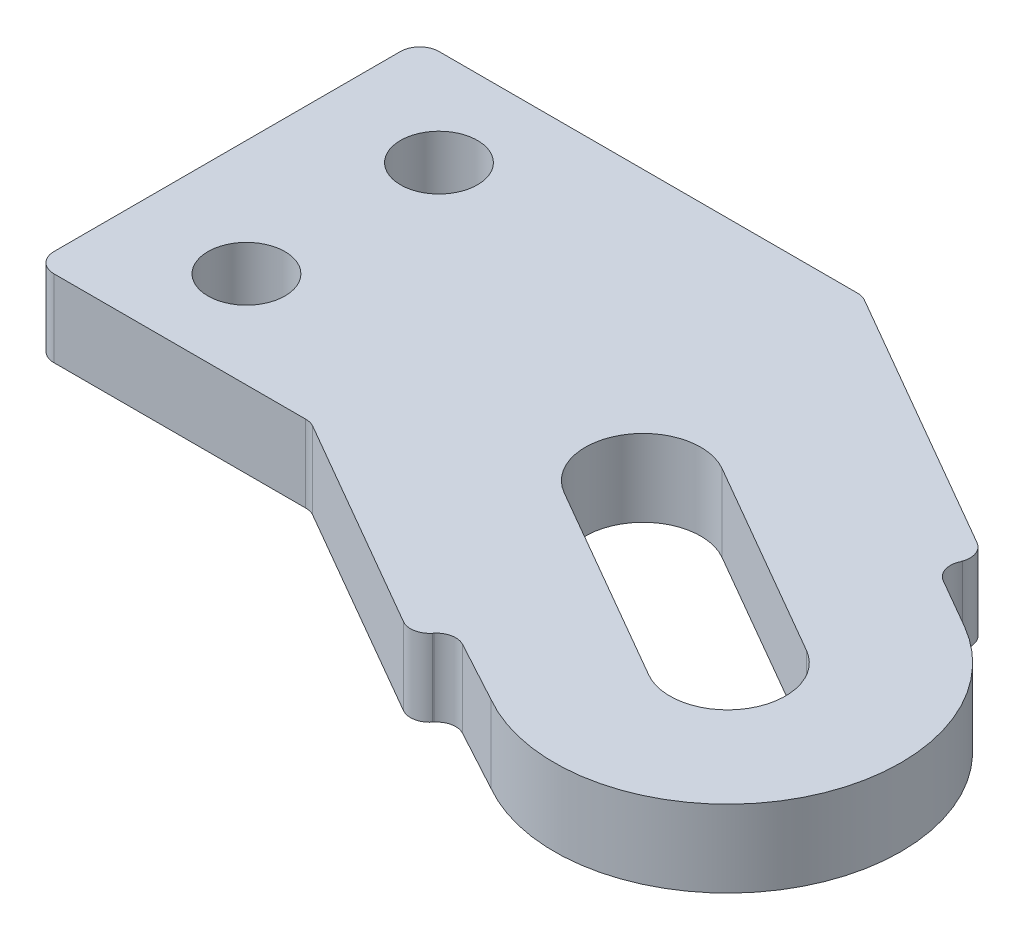
ISO-10303-21;
HEADER;
FILE_DESCRIPTION(('STEP AP214'),'2;1');
FILE_NAME('part.step','',(''),(''),'','','');
FILE_SCHEMA(('AUTOMOTIVE_DESIGN { 1 0 10303 214 1 1 1 1 }'));
ENDSEC;
DATA;
#1=APPLICATION_CONTEXT('core data for automotive mechanical design processes');
#2=APPLICATION_PROTOCOL_DEFINITION('international standard','automotive_design',2000,#1);
#3=PRODUCT_CONTEXT('',#1,'mechanical');
#4=PRODUCT('Part','Part','',(#3));
#5=PRODUCT_RELATED_PRODUCT_CATEGORY('part','',(#4));
#6=PRODUCT_DEFINITION_FORMATION('','',#4);
#7=PRODUCT_DEFINITION_CONTEXT('part definition',#1,'design');
#8=PRODUCT_DEFINITION('design','',#6,#7);
#9=PRODUCT_DEFINITION_SHAPE('','',#8);
#10=(LENGTH_UNIT() NAMED_UNIT(*) SI_UNIT(.MILLI.,.METRE.));
#11=(NAMED_UNIT(*) PLANE_ANGLE_UNIT() SI_UNIT($,.RADIAN.));
#12=(NAMED_UNIT(*) SI_UNIT($,.STERADIAN.) SOLID_ANGLE_UNIT());
#13=UNCERTAINTY_MEASURE_WITH_UNIT(LENGTH_MEASURE(1.E-05),#10,'distance_accuracy_value','');
#14=(GEOMETRIC_REPRESENTATION_CONTEXT(3) GLOBAL_UNCERTAINTY_ASSIGNED_CONTEXT((#13)) GLOBAL_UNIT_ASSIGNED_CONTEXT((#10,
#11,#12)) REPRESENTATION_CONTEXT('',''));
#15=CARTESIAN_POINT('',(0.,0.,0.));
#16=DIRECTION('',(0.,0.,1.));
#17=DIRECTION('',(1.,0.,0.));
#18=AXIS2_PLACEMENT_3D('',#15,#16,#17);
#19=CARTESIAN_POINT('',(0.125,0.5,-0.125));
#20=DIRECTION('',(0.,-1.,0.));
#21=DIRECTION('',(0.,0.,-1.));
#22=AXIS2_PLACEMENT_3D('',#19,#20,#21);
#23=PLANE('',#22);
#24=CARTESIAN_POINT('',(0.75,0.5,-0.625));
#25=DIRECTION('',(0.,1.,0.));
#26=DIRECTION('',(0.,0.,1.));
#27=AXIS2_PLACEMENT_3D('',#24,#25,#26);
#28=CIRCLE('',#27,0.25);
#29=CARTESIAN_POINT('',(0.75,0.5,-0.375));
#30=VERTEX_POINT('',#29);
#31=EDGE_CURVE('E236',#30,#30,#28,.T.);
#32=ORIENTED_EDGE('',*,*,#31,.F.);
#33=EDGE_LOOP('',(#32));
#34=FACE_BOUND('',#33,.T.);
#35=CARTESIAN_POINT('',(0.75,0.5,-1.875));
#36=DIRECTION('',(0.,1.,0.));
#37=DIRECTION('',(0.,0.,1.));
#38=AXIS2_PLACEMENT_3D('',#35,#36,#37);
#39=CIRCLE('',#38,0.25);
#40=CARTESIAN_POINT('',(0.75,0.5,-1.625));
#41=VERTEX_POINT('',#40);
#42=EDGE_CURVE('E244',#41,#41,#39,.T.);
#43=ORIENTED_EDGE('',*,*,#42,.F.);
#44=EDGE_LOOP('',(#43));
#45=FACE_BOUND('',#44,.T.);
#46=CARTESIAN_POINT('',(0.125,0.5,-0.125));
#47=DIRECTION('',(0.,1.,0.));
#48=DIRECTION('',(0.,0.,-1.));
#49=AXIS2_PLACEMENT_3D('',#46,#47,#48);
#50=CIRCLE('',#49,0.125);
#51=CARTESIAN_POINT('',(0.,0.5,-0.125000000000001));
#52=VERTEX_POINT('',#51);
#53=CARTESIAN_POINT('',(0.125000000000001,0.5,0.));
#54=VERTEX_POINT('',#53);
#55=EDGE_CURVE('E252',#52,#54,#50,.T.);
#56=ORIENTED_EDGE('',*,*,#55,.T.);
#57=DIRECTION('',(1.,0.,0.));
#58=VECTOR('',#57,1.);
#59=CARTESIAN_POINT('',(0.125000000000001,0.5,0.));
#60=LINE('',#59,#58);
#61=CARTESIAN_POINT('',(1.75963336986831,0.5,0.));
#62=VERTEX_POINT('',#61);
#63=EDGE_CURVE('E256',#54,#62,#60,.T.);
#64=ORIENTED_EDGE('',*,*,#63,.T.);
#65=CARTESIAN_POINT('',(1.75963336986831,0.5,0.125));
#66=DIRECTION('',(0.,-1.,0.));
#67=DIRECTION('',(0.,0.,1.));
#68=AXIS2_PLACEMENT_3D('',#65,#66,#67);
#69=CIRCLE('',#68,0.125);
#70=CARTESIAN_POINT('',(1.82213336986831,0.5,0.0167468245269446));
#71=VERTEX_POINT('',#70);
#72=EDGE_CURVE('E260',#62,#71,#69,.T.);
#73=ORIENTED_EDGE('',*,*,#72,.T.);
#74=DIRECTION('',(0.866025403784442,0.,0.499999999999995));
#75=VECTOR('',#74,1.);
#76=CARTESIAN_POINT('',(1.82213336986831,0.5,0.0167468245269448));
#77=LINE('',#76,#75);
#78=CARTESIAN_POINT('',(3.21597478502807,0.5,0.821481540777074));
#79=VERTEX_POINT('',#78);
#80=EDGE_CURVE('E263',#71,#79,#77,.T.);
#81=ORIENTED_EDGE('',*,*,#80,.T.);
#82=CARTESIAN_POINT('',(3.27847478502807,0.5,0.713228365304019));
#83=DIRECTION('',(0.,1.,0.));
#84=DIRECTION('',(0.,0.,-1.));
#85=AXIS2_PLACEMENT_3D('',#82,#83,#84);
#86=CIRCLE('',#85,0.125);
#87=CARTESIAN_POINT('',(3.37501037670369,0.5,0.792637933618159));
#88=VERTEX_POINT('',#87);
#89=EDGE_CURVE('E266',#79,#88,#86,.T.);
#90=ORIENTED_EDGE('',*,*,#89,.T.);
#91=DIRECTION('',(0.635276546513139,0.,-0.772284733404941));
#92=VECTOR('',#91,1.);
#93=CARTESIAN_POINT('',(3.37917869838538,0.5,0.787570642504779));
#94=LINE('',#93,#92);
#95=CARTESIAN_POINT('',(3.37917869838538,0.5,0.787570642504779));
#96=VERTEX_POINT('',#95);
#97=EDGE_CURVE('E269',#88,#96,#94,.T.);
#98=ORIENTED_EDGE('',*,*,#97,.T.);
#99=CARTESIAN_POINT('',(3.475714290061,0.5,0.866980210818919));
#100=DIRECTION('',(0.,-1.,0.));
#101=DIRECTION('',(0.,0.,1.));
#102=AXIS2_PLACEMENT_3D('',#99,#100,#101);
#103=CIRCLE('',#102,0.125);
#104=CARTESIAN_POINT('',(3.53520672351242,0.5,0.757045455795643));
#105=VERTEX_POINT('',#104);
#106=EDGE_CURVE('E272',#96,#105,#103,.T.);
#107=ORIENTED_EDGE('',*,*,#106,.T.);
#108=DIRECTION('',(0.879478040186208,0.,0.475939467611403));
#109=VECTOR('',#108,1.);
#110=CARTESIAN_POINT('',(3.93662701892223,0.5,0.974278579257496));
#111=LINE('',#110,#109);
#112=CARTESIAN_POINT('',(3.93662701892223,0.5,0.974278579257496));
#113=VERTEX_POINT('',#112);
#114=EDGE_CURVE('E275',#105,#113,#111,.T.);
#115=ORIENTED_EDGE('',*,*,#114,.T.);
#116=CARTESIAN_POINT('',(4.49912701892223,0.5,0.));
#117=DIRECTION('',(0.,1.,0.));
#118=DIRECTION('',(0.,0.,1.));
#119=AXIS2_PLACEMENT_3D('',#116,#117,#118);
#120=CIRCLE('',#119,1.125);
#121=CARTESIAN_POINT('',(5.06162703758664,0.5,-0.974278568481588));
#122=VERTEX_POINT('',#121);
#123=EDGE_CURVE('E278',#113,#122,#120,.T.);
#124=ORIENTED_EDGE('',*,*,#123,.T.);
#125=DIRECTION('',(-0.866025403784443,0.,-0.499999999999993));
#126=VECTOR('',#125,1.);
#127=CARTESIAN_POINT('',(5.06162703758664,0.5,-0.974278568481589));
#128=LINE('',#127,#126);
#129=CARTESIAN_POINT('',(4.73773353866167,0.5,-1.16127856727469));
#130=VERTEX_POINT('',#129);
#131=EDGE_CURVE('E281',#122,#130,#128,.T.);
#132=ORIENTED_EDGE('',*,*,#131,.T.);
#133=CARTESIAN_POINT('',(4.80073353866167,0.5,-1.27039776815153));
#134=DIRECTION('',(0.,-1.,0.));
#135=DIRECTION('',(0.,0.,-1.));
#136=AXIS2_PLACEMENT_3D('',#133,#134,#135);
#137=CIRCLE('',#136,0.126);
#138=CARTESIAN_POINT('',(4.69161433899173,0.5,-1.33339777024194));
#139=VERTEX_POINT('',#138);
#140=EDGE_CURVE('E284',#130,#139,#137,.T.);
#141=ORIENTED_EDGE('',*,*,#140,.T.);
#142=DIRECTION('',(-0.500000016590592,0.,0.866025394205856));
#143=VECTOR('',#142,1.);
#144=CARTESIAN_POINT('',(4.69161433899173,0.5,-1.33339777024194));
#145=LINE('',#144,#143);
#146=CARTESIAN_POINT('',(4.68011433620593,0.5,-1.31347918201097));
#147=VERTEX_POINT('',#146);
#148=EDGE_CURVE('E287',#139,#147,#145,.T.);
#149=ORIENTED_EDGE('',*,*,#148,.T.);
#150=CARTESIAN_POINT('',(4.57186116193019,0.5,-1.37597918408479));
#151=DIRECTION('',(0.,1.,0.));
#152=DIRECTION('',(0.,0.,1.));
#153=AXIS2_PLACEMENT_3D('',#150,#151,#152);
#154=CIRCLE('',#153,0.125);
#155=CARTESIAN_POINT('',(4.63436116193019,0.5,-1.48423235955784));
#156=VERTEX_POINT('',#155);
#157=EDGE_CURVE('E290',#147,#156,#154,.T.);
#158=ORIENTED_EDGE('',*,*,#157,.T.);
#159=DIRECTION('',(-0.866025403784442,0.,-0.499999999999994));
#160=VECTOR('',#159,1.);
#161=CARTESIAN_POINT('',(2.90400635094611,0.5,-2.48325317547306));
#162=LINE('',#161,#160);
#163=CARTESIAN_POINT('',(2.90400635094611,0.5,-2.48325317547306));
#164=VERTEX_POINT('',#163);
#165=EDGE_CURVE('E293',#156,#164,#162,.T.);
#166=ORIENTED_EDGE('',*,*,#165,.T.);
#167=CARTESIAN_POINT('',(2.84150635094611,0.5,-2.375));
#168=DIRECTION('',(0.,1.,0.));
#169=DIRECTION('',(0.,0.,1.));
#170=AXIS2_PLACEMENT_3D('',#167,#168,#169);
#171=CIRCLE('',#170,0.125);
#172=CARTESIAN_POINT('',(2.84150635094611,0.5,-2.5));
#173=VERTEX_POINT('',#172);
#174=EDGE_CURVE('E296',#164,#173,#171,.T.);
#175=ORIENTED_EDGE('',*,*,#174,.T.);
#176=DIRECTION('',(-1.,0.,0.));
#177=VECTOR('',#176,1.);
#178=CARTESIAN_POINT('',(2.84150635094611,0.5,-2.5));
#179=LINE('',#178,#177);
#180=CARTESIAN_POINT('',(0.125000000000001,0.5,-2.5));
#181=VERTEX_POINT('',#180);
#182=EDGE_CURVE('E299',#173,#181,#179,.T.);
#183=ORIENTED_EDGE('',*,*,#182,.T.);
#184=CARTESIAN_POINT('',(0.125,0.5,-2.375));
#185=DIRECTION('',(0.,1.,0.));
#186=DIRECTION('',(0.,0.,-1.));
#187=AXIS2_PLACEMENT_3D('',#184,#185,#186);
#188=CIRCLE('',#187,0.125);
#189=CARTESIAN_POINT('',(0.,0.5,-2.375));
#190=VERTEX_POINT('',#189);
#191=EDGE_CURVE('E302',#181,#190,#188,.T.);
#192=ORIENTED_EDGE('',*,*,#191,.T.);
#193=DIRECTION('',(0.,0.,1.));
#194=VECTOR('',#193,1.);
#195=CARTESIAN_POINT('',(0.,0.5,-0.125000000000001));
#196=LINE('',#195,#194);
#197=EDGE_CURVE('E305',#190,#52,#196,.T.);
#198=ORIENTED_EDGE('',*,*,#197,.T.);
#199=EDGE_LOOP('',(#56,#64,#73,#81,#90,#98,#107,#115,#124,#132,#141,#149,#158,#166,#175,#183,
#192,#198));
#200=FACE_BOUND('',#199,.T.);
#201=CARTESIAN_POINT('',(3.20008891324556,0.5,-0.749999999999992));
#202=DIRECTION('',(0.,1.,0.));
#203=DIRECTION('',(0.,0.,-1.));
#204=AXIS2_PLACEMENT_3D('',#201,#202,#203);
#205=CIRCLE('',#204,0.375);
#206=CARTESIAN_POINT('',(3.38758891324556,0.5,-1.07475952641916));
#207=VERTEX_POINT('',#206);
#208=CARTESIAN_POINT('',(3.01258891324556,0.5,-0.425240473580827));
#209=VERTEX_POINT('',#208);
#210=EDGE_CURVE('E188',#207,#209,#205,.T.);
#211=ORIENTED_EDGE('',*,*,#210,.F.);
#212=DIRECTION('',(-0.866025403784442,0.,-0.499999999999995));
#213=VECTOR('',#212,1.);
#214=CARTESIAN_POINT('',(3.38758891324556,0.5,-1.07475952641916));
#215=LINE('',#214,#213);
#216=CARTESIAN_POINT('',(4.68662701892222,0.5,-0.324759526419166));
#217=VERTEX_POINT('',#216);
#218=EDGE_CURVE('E214',#217,#207,#215,.T.);
#219=ORIENTED_EDGE('',*,*,#218,.F.);
#220=CARTESIAN_POINT('',(4.49912701892223,0.5,0.));
#221=DIRECTION('',(0.,1.,0.));
#222=DIRECTION('',(0.,0.,-1.));
#223=AXIS2_PLACEMENT_3D('',#220,#221,#222);
#224=CIRCLE('',#223,0.375);
#225=CARTESIAN_POINT('',(4.31162701892223,0.5,0.324759526419166));
#226=VERTEX_POINT('',#225);
#227=EDGE_CURVE('E210',#226,#217,#224,.T.);
#228=ORIENTED_EDGE('',*,*,#227,.F.);
#229=DIRECTION('',(0.866025403784442,0.,0.499999999999994));
#230=VECTOR('',#229,1.);
#231=CARTESIAN_POINT('',(3.01258891324556,0.5,-0.425240473580827));
#232=LINE('',#231,#230);
#233=EDGE_CURVE('E197',#209,#226,#232,.T.);
#234=ORIENTED_EDGE('',*,*,#233,.F.);
#235=EDGE_LOOP('',(#211,#219,#228,#234));
#236=FACE_BOUND('',#235,.T.);
#237=ADVANCED_FACE('F38',(#34,#45,#200,#236),#23,.F.);
#238=CARTESIAN_POINT('',(0.125,0.,-0.125));
#239=DIRECTION('',(0.,-1.,0.));
#240=DIRECTION('',(0.,0.,-1.));
#241=AXIS2_PLACEMENT_3D('',#238,#239,#240);
#242=PLANE('',#241);
#243=CARTESIAN_POINT('',(0.75,0.,-1.875));
#244=DIRECTION('',(0.,1.,0.));
#245=DIRECTION('',(0.,0.,1.));
#246=AXIS2_PLACEMENT_3D('',#243,#244,#245);
#247=CIRCLE('',#246,0.25);
#248=CARTESIAN_POINT('',(0.75,0.,-1.625));
#249=VERTEX_POINT('',#248);
#250=EDGE_CURVE('E240',#249,#249,#247,.T.);
#251=ORIENTED_EDGE('',*,*,#250,.T.);
#252=EDGE_LOOP('',(#251));
#253=FACE_BOUND('',#252,.T.);
#254=CARTESIAN_POINT('',(0.125,0.,-0.125));
#255=DIRECTION('',(0.,1.,0.));
#256=DIRECTION('',(0.,0.,-1.));
#257=AXIS2_PLACEMENT_3D('',#254,#255,#256);
#258=CIRCLE('',#257,0.125);
#259=CARTESIAN_POINT('',(0.,0.,-0.125000000000001));
#260=VERTEX_POINT('',#259);
#261=CARTESIAN_POINT('',(0.125000000000001,0.,0.));
#262=VERTEX_POINT('',#261);
#263=EDGE_CURVE('E248',#260,#262,#258,.T.);
#264=ORIENTED_EDGE('',*,*,#263,.F.);
#265=DIRECTION('',(0.,0.,1.));
#266=VECTOR('',#265,1.);
#267=CARTESIAN_POINT('',(0.,0.,-0.125000000000001));
#268=LINE('',#267,#266);
#269=CARTESIAN_POINT('',(0.,0.,-2.375));
#270=VERTEX_POINT('',#269);
#271=EDGE_CURVE('E257',#270,#260,#268,.T.);
#272=ORIENTED_EDGE('',*,*,#271,.F.);
#273=CARTESIAN_POINT('',(0.125,0.,-2.375));
#274=DIRECTION('',(0.,1.,0.));
#275=DIRECTION('',(0.,0.,-1.));
#276=AXIS2_PLACEMENT_3D('',#273,#274,#275);
#277=CIRCLE('',#276,0.125);
#278=CARTESIAN_POINT('',(0.125000000000001,0.,-2.5));
#279=VERTEX_POINT('',#278);
#280=EDGE_CURVE('E357',#279,#270,#277,.T.);
#281=ORIENTED_EDGE('',*,*,#280,.F.);
#282=DIRECTION('',(-1.,0.,0.));
#283=VECTOR('',#282,1.);
#284=CARTESIAN_POINT('',(2.84150635094611,0.,-2.5));
#285=LINE('',#284,#283);
#286=CARTESIAN_POINT('',(2.84150635094611,0.,-2.5));
#287=VERTEX_POINT('',#286);
#288=EDGE_CURVE('E354',#287,#279,#285,.T.);
#289=ORIENTED_EDGE('',*,*,#288,.F.);
#290=CARTESIAN_POINT('',(2.84150635094611,0.,-2.375));
#291=DIRECTION('',(0.,1.,0.));
#292=DIRECTION('',(0.,0.,1.));
#293=AXIS2_PLACEMENT_3D('',#290,#291,#292);
#294=CIRCLE('',#293,0.125);
#295=CARTESIAN_POINT('',(2.90400635094611,0.,-2.48325317547306));
#296=VERTEX_POINT('',#295);
#297=EDGE_CURVE('E351',#296,#287,#294,.T.);
#298=ORIENTED_EDGE('',*,*,#297,.F.);
#299=DIRECTION('',(-0.866025403784442,0.,-0.499999999999994));
#300=VECTOR('',#299,1.);
#301=CARTESIAN_POINT('',(2.90400635094611,0.,-2.48325317547306));
#302=LINE('',#301,#300);
#303=CARTESIAN_POINT('',(4.63436116193019,0.,-1.48423235955784));
#304=VERTEX_POINT('',#303);
#305=EDGE_CURVE('E348',#304,#296,#302,.T.);
#306=ORIENTED_EDGE('',*,*,#305,.F.);
#307=CARTESIAN_POINT('',(4.57186116193019,0.,-1.37597918408479));
#308=DIRECTION('',(0.,1.,0.));
#309=DIRECTION('',(0.,0.,1.));
#310=AXIS2_PLACEMENT_3D('',#307,#308,#309);
#311=CIRCLE('',#310,0.125);
#312=CARTESIAN_POINT('',(4.68011433620593,0.,-1.31347918201097));
#313=VERTEX_POINT('',#312);
#314=EDGE_CURVE('E345',#313,#304,#311,.T.);
#315=ORIENTED_EDGE('',*,*,#314,.F.);
#316=DIRECTION('',(-0.500000016590592,0.,0.866025394205856));
#317=VECTOR('',#316,1.);
#318=CARTESIAN_POINT('',(4.69161433899173,0.,-1.33339777024194));
#319=LINE('',#318,#317);
#320=CARTESIAN_POINT('',(4.69161433899173,0.,-1.33339777024194));
#321=VERTEX_POINT('',#320);
#322=EDGE_CURVE('E342',#321,#313,#319,.T.);
#323=ORIENTED_EDGE('',*,*,#322,.F.);
#324=CARTESIAN_POINT('',(4.80073353866167,0.,-1.27039776815153));
#325=DIRECTION('',(0.,-1.,0.));
#326=DIRECTION('',(0.,0.,-1.));
#327=AXIS2_PLACEMENT_3D('',#324,#325,#326);
#328=CIRCLE('',#327,0.126);
#329=CARTESIAN_POINT('',(4.73773353866167,0.,-1.16127856727469));
#330=VERTEX_POINT('',#329);
#331=EDGE_CURVE('E339',#330,#321,#328,.T.);
#332=ORIENTED_EDGE('',*,*,#331,.F.);
#333=DIRECTION('',(-0.866025403784443,0.,-0.499999999999993));
#334=VECTOR('',#333,1.);
#335=CARTESIAN_POINT('',(5.06162703758664,0.,-0.974278568481589));
#336=LINE('',#335,#334);
#337=CARTESIAN_POINT('',(5.06162703758664,0.,-0.974278568481588));
#338=VERTEX_POINT('',#337);
#339=EDGE_CURVE('E336',#338,#330,#336,.T.);
#340=ORIENTED_EDGE('',*,*,#339,.F.);
#341=CARTESIAN_POINT('',(4.49912701892223,0.,0.));
#342=DIRECTION('',(0.,1.,0.));
#343=DIRECTION('',(0.,0.,1.));
#344=AXIS2_PLACEMENT_3D('',#341,#342,#343);
#345=CIRCLE('',#344,1.125);
#346=CARTESIAN_POINT('',(3.93662701892223,0.,0.974278579257496));
#347=VERTEX_POINT('',#346);
#348=EDGE_CURVE('E333',#347,#338,#345,.T.);
#349=ORIENTED_EDGE('',*,*,#348,.F.);
#350=DIRECTION('',(0.879478040186208,0.,0.475939467611403));
#351=VECTOR('',#350,1.);
#352=CARTESIAN_POINT('',(3.93662701892223,0.,0.974278579257496));
#353=LINE('',#352,#351);
#354=CARTESIAN_POINT('',(3.53520672351242,0.,0.757045455795643));
#355=VERTEX_POINT('',#354);
#356=EDGE_CURVE('E330',#355,#347,#353,.T.);
#357=ORIENTED_EDGE('',*,*,#356,.F.);
#358=CARTESIAN_POINT('',(3.475714290061,0.,0.866980210818919));
#359=DIRECTION('',(0.,-1.,0.));
#360=DIRECTION('',(0.,0.,1.));
#361=AXIS2_PLACEMENT_3D('',#358,#359,#360);
#362=CIRCLE('',#361,0.125);
#363=CARTESIAN_POINT('',(3.37917869838538,0.,0.787570642504779));
#364=VERTEX_POINT('',#363);
#365=EDGE_CURVE('E327',#364,#355,#362,.T.);
#366=ORIENTED_EDGE('',*,*,#365,.F.);
#367=DIRECTION('',(0.635276546513139,0.,-0.772284733404941));
#368=VECTOR('',#367,1.);
#369=CARTESIAN_POINT('',(3.37917869838538,0.,0.787570642504779));
#370=LINE('',#369,#368);
#371=CARTESIAN_POINT('',(3.37501037670369,0.,0.792637933618159));
#372=VERTEX_POINT('',#371);
#373=EDGE_CURVE('E324',#372,#364,#370,.T.);
#374=ORIENTED_EDGE('',*,*,#373,.F.);
#375=CARTESIAN_POINT('',(3.27847478502807,0.,0.713228365304019));
#376=DIRECTION('',(0.,1.,0.));
#377=DIRECTION('',(0.,0.,-1.));
#378=AXIS2_PLACEMENT_3D('',#375,#376,#377);
#379=CIRCLE('',#378,0.125);
#380=CARTESIAN_POINT('',(3.21597478502807,0.,0.821481540777074));
#381=VERTEX_POINT('',#380);
#382=EDGE_CURVE('E321',#381,#372,#379,.T.);
#383=ORIENTED_EDGE('',*,*,#382,.F.);
#384=DIRECTION('',(0.866025403784442,0.,0.499999999999995));
#385=VECTOR('',#384,1.);
#386=CARTESIAN_POINT('',(1.82213336986831,0.,0.0167468245269448));
#387=LINE('',#386,#385);
#388=CARTESIAN_POINT('',(1.82213336986831,0.,0.0167468245269446));
#389=VERTEX_POINT('',#388);
#390=EDGE_CURVE('E318',#389,#381,#387,.T.);
#391=ORIENTED_EDGE('',*,*,#390,.F.);
#392=CARTESIAN_POINT('',(1.75963336986831,0.,0.125));
#393=DIRECTION('',(0.,-1.,0.));
#394=DIRECTION('',(0.,0.,1.));
#395=AXIS2_PLACEMENT_3D('',#392,#393,#394);
#396=CIRCLE('',#395,0.125);
#397=CARTESIAN_POINT('',(1.75963336986831,0.,0.));
#398=VERTEX_POINT('',#397);
#399=EDGE_CURVE('E315',#398,#389,#396,.T.);
#400=ORIENTED_EDGE('',*,*,#399,.F.);
#401=DIRECTION('',(1.,0.,0.));
#402=VECTOR('',#401,1.);
#403=CARTESIAN_POINT('',(0.125000000000001,0.,0.));
#404=LINE('',#403,#402);
#405=EDGE_CURVE('E312',#262,#398,#404,.T.);
#406=ORIENTED_EDGE('',*,*,#405,.F.);
#407=EDGE_LOOP('',(#264,#272,#281,#289,#298,#306,#315,#323,#332,#340,#349,#357,#366,#374,#383,
#391,#400,#406));
#408=FACE_BOUND('',#407,.T.);
#409=CARTESIAN_POINT('',(0.75,0.,-0.625));
#410=DIRECTION('',(0.,1.,0.));
#411=DIRECTION('',(0.,0.,1.));
#412=AXIS2_PLACEMENT_3D('',#409,#410,#411);
#413=CIRCLE('',#412,0.25);
#414=CARTESIAN_POINT('',(0.75,0.,-0.375));
#415=VERTEX_POINT('',#414);
#416=EDGE_CURVE('E206',#415,#415,#413,.T.);
#417=ORIENTED_EDGE('',*,*,#416,.T.);
#418=EDGE_LOOP('',(#417));
#419=FACE_BOUND('',#418,.T.);
#420=DIRECTION('',(-0.866025403784442,0.,-0.499999999999995));
#421=VECTOR('',#420,1.);
#422=CARTESIAN_POINT('',(3.38758891324556,0.,-1.07475952641916));
#423=LINE('',#422,#421);
#424=CARTESIAN_POINT('',(4.68662701892222,0.,-0.324759526419165));
#425=VERTEX_POINT('',#424);
#426=CARTESIAN_POINT('',(3.38758891324556,0.,-1.07475952641916));
#427=VERTEX_POINT('',#426);
#428=EDGE_CURVE('E198',#425,#427,#423,.T.);
#429=ORIENTED_EDGE('',*,*,#428,.T.);
#430=CARTESIAN_POINT('',(3.20008891324556,0.,-0.749999999999992));
#431=DIRECTION('',(0.,1.,0.));
#432=DIRECTION('',(0.,0.,-1.));
#433=AXIS2_PLACEMENT_3D('',#430,#431,#432);
#434=CIRCLE('',#433,0.375);
#435=CARTESIAN_POINT('',(3.01258891324556,0.,-0.425240473580827));
#436=VERTEX_POINT('',#435);
#437=EDGE_CURVE('E62',#427,#436,#434,.T.);
#438=ORIENTED_EDGE('',*,*,#437,.T.);
#439=DIRECTION('',(0.866025403784442,0.,0.499999999999994));
#440=VECTOR('',#439,1.);
#441=CARTESIAN_POINT('',(3.01258891324556,0.,-0.425240473580827));
#442=LINE('',#441,#440);
#443=CARTESIAN_POINT('',(4.31162701892223,0.,0.324759526419166));
#444=VERTEX_POINT('',#443);
#445=EDGE_CURVE('E204',#436,#444,#442,.T.);
#446=ORIENTED_EDGE('',*,*,#445,.T.);
#447=CARTESIAN_POINT('',(4.49912701892223,0.,0.));
#448=DIRECTION('',(0.,1.,0.));
#449=DIRECTION('',(0.,0.,-1.));
#450=AXIS2_PLACEMENT_3D('',#447,#448,#449);
#451=CIRCLE('',#450,0.375);
#452=EDGE_CURVE('E223',#444,#425,#451,.T.);
#453=ORIENTED_EDGE('',*,*,#452,.T.);
#454=EDGE_LOOP('',(#429,#438,#446,#453));
#455=FACE_BOUND('',#454,.T.);
#456=ADVANCED_FACE('F436',(#253,#408,#419,#455),#242,.T.);
#457=CARTESIAN_POINT('',(0.125,0.5,-0.125));
#458=DIRECTION('',(0.,-1.,0.));
#459=DIRECTION('',(0.,0.,-1.));
#460=AXIS2_PLACEMENT_3D('',#457,#458,#459);
#461=CYLINDRICAL_SURFACE('',#460,0.125);
#462=ORIENTED_EDGE('',*,*,#263,.T.);
#463=DIRECTION('',(0.,-1.,0.));
#464=VECTOR('',#463,1.);
#465=CARTESIAN_POINT('',(0.125000000000001,0.5,0.));
#466=LINE('',#465,#464);
#467=EDGE_CURVE('E11',#54,#262,#466,.T.);
#468=ORIENTED_EDGE('',*,*,#467,.F.);
#469=ORIENTED_EDGE('',*,*,#55,.F.);
#470=DIRECTION('',(0.,-1.,0.));
#471=VECTOR('',#470,1.);
#472=CARTESIAN_POINT('',(0.,0.5,-0.125000000000001));
#473=LINE('',#472,#471);
#474=EDGE_CURVE('E308',#52,#260,#473,.T.);
#475=ORIENTED_EDGE('',*,*,#474,.T.);
#476=EDGE_LOOP('',(#462,#468,#469,#475));
#477=FACE_BOUND('',#476,.T.);
#478=ADVANCED_FACE('F40',(#477),#461,.T.);
#479=CARTESIAN_POINT('',(0.125000000000001,0.5,0.));
#480=DIRECTION('',(0.,0.,-1.));
#481=DIRECTION('',(-1.,0.,0.));
#482=AXIS2_PLACEMENT_3D('',#479,#480,#481);
#483=PLANE('',#482);
#484=ORIENTED_EDGE('',*,*,#405,.T.);
#485=DIRECTION('',(0.,-1.,0.));
#486=VECTOR('',#485,1.);
#487=CARTESIAN_POINT('',(1.75963336986831,0.5,0.));
#488=LINE('',#487,#486);
#489=EDGE_CURVE('E47',#62,#398,#488,.T.);
#490=ORIENTED_EDGE('',*,*,#489,.F.);
#491=ORIENTED_EDGE('',*,*,#63,.F.);
#492=ORIENTED_EDGE('',*,*,#467,.T.);
#493=EDGE_LOOP('',(#484,#490,#491,#492));
#494=FACE_BOUND('',#493,.T.);
#495=ADVANCED_FACE('F453',(#494),#483,.F.);
#496=CARTESIAN_POINT('',(1.75963336986831,0.5,0.125));
#497=DIRECTION('',(0.,-1.,0.));
#498=DIRECTION('',(0.,0.,-1.));
#499=AXIS2_PLACEMENT_3D('',#496,#497,#498);
#500=CYLINDRICAL_SURFACE('',#499,0.125);
#501=ORIENTED_EDGE('',*,*,#399,.T.);
#502=DIRECTION('',(0.,-1.,0.));
#503=VECTOR('',#502,1.);
#504=CARTESIAN_POINT('',(1.82213336986831,0.5,0.0167468245269446));
#505=LINE('',#504,#503);
#506=EDGE_CURVE('E421',#71,#389,#505,.T.);
#507=ORIENTED_EDGE('',*,*,#506,.F.);
#508=ORIENTED_EDGE('',*,*,#72,.F.);
#509=ORIENTED_EDGE('',*,*,#489,.T.);
#510=EDGE_LOOP('',(#501,#507,#508,#509));
#511=FACE_BOUND('',#510,.T.);
#512=ADVANCED_FACE('F430',(#511),#500,.F.);
#513=CARTESIAN_POINT('',(1.82213336986831,0.5,0.0167468245269448));
#514=DIRECTION('',(0.499999999999995,0.,-0.866025403784442));
#515=DIRECTION('',(-0.866025403784442,0.,-0.499999999999995));
#516=AXIS2_PLACEMENT_3D('',#513,#514,#515);
#517=PLANE('',#516);
#518=ORIENTED_EDGE('',*,*,#390,.T.);
#519=DIRECTION('',(0.,-1.,0.));
#520=VECTOR('',#519,1.);
#521=CARTESIAN_POINT('',(3.21597478502807,0.5,0.821481540777074));
#522=LINE('',#521,#520);
#523=EDGE_CURVE('E417',#79,#381,#522,.T.);
#524=ORIENTED_EDGE('',*,*,#523,.F.);
#525=ORIENTED_EDGE('',*,*,#80,.F.);
#526=ORIENTED_EDGE('',*,*,#506,.T.);
#527=EDGE_LOOP('',(#518,#524,#525,#526));
#528=FACE_BOUND('',#527,.T.);
#529=ADVANCED_FACE('F442',(#528),#517,.F.);
#530=CARTESIAN_POINT('',(3.27847478502807,0.5,0.713228365304019));
#531=DIRECTION('',(0.,-1.,0.));
#532=DIRECTION('',(0.,0.,-1.));
#533=AXIS2_PLACEMENT_3D('',#530,#531,#532);
#534=CYLINDRICAL_SURFACE('',#533,0.125);
#535=ORIENTED_EDGE('',*,*,#382,.T.);
#536=DIRECTION('',(0.,-1.,0.));
#537=VECTOR('',#536,1.);
#538=CARTESIAN_POINT('',(3.37501037670369,0.5,0.792637933618159));
#539=LINE('',#538,#537);
#540=EDGE_CURVE('E413',#88,#372,#539,.T.);
#541=ORIENTED_EDGE('',*,*,#540,.F.);
#542=ORIENTED_EDGE('',*,*,#89,.F.);
#543=ORIENTED_EDGE('',*,*,#523,.T.);
#544=EDGE_LOOP('',(#535,#541,#542,#543));
#545=FACE_BOUND('',#544,.T.);
#546=ADVANCED_FACE('F446',(#545),#534,.T.);
#547=CARTESIAN_POINT('',(3.37917869838538,0.5,0.787570642504779));
#548=DIRECTION('',(-0.772284733404941,0.,-0.635276546513139));
#549=DIRECTION('',(-0.635276546513139,0.,0.772284733404941));
#550=AXIS2_PLACEMENT_3D('',#547,#548,#549);
#551=PLANE('',#550);
#552=ORIENTED_EDGE('',*,*,#373,.T.);
#553=DIRECTION('',(0.,-1.,0.));
#554=VECTOR('',#553,1.);
#555=CARTESIAN_POINT('',(3.37917869838538,0.5,0.787570642504779));
#556=LINE('',#555,#554);
#557=EDGE_CURVE('E409',#96,#364,#556,.T.);
#558=ORIENTED_EDGE('',*,*,#557,.F.);
#559=ORIENTED_EDGE('',*,*,#97,.F.);
#560=ORIENTED_EDGE('',*,*,#540,.T.);
#561=EDGE_LOOP('',(#552,#558,#559,#560));
#562=FACE_BOUND('',#561,.T.);
#563=ADVANCED_FACE('F516',(#562),#551,.F.);
#564=CARTESIAN_POINT('',(3.475714290061,0.5,0.866980210818919));
#565=DIRECTION('',(0.,-1.,0.));
#566=DIRECTION('',(0.,0.,-1.));
#567=AXIS2_PLACEMENT_3D('',#564,#565,#566);
#568=CYLINDRICAL_SURFACE('',#567,0.125);
#569=ORIENTED_EDGE('',*,*,#365,.T.);
#570=DIRECTION('',(0.,-1.,0.));
#571=VECTOR('',#570,1.);
#572=CARTESIAN_POINT('',(3.53520672351242,0.5,0.757045455795643));
#573=LINE('',#572,#571);
#574=EDGE_CURVE('E405',#105,#355,#573,.T.);
#575=ORIENTED_EDGE('',*,*,#574,.F.);
#576=ORIENTED_EDGE('',*,*,#106,.F.);
#577=ORIENTED_EDGE('',*,*,#557,.T.);
#578=EDGE_LOOP('',(#569,#575,#576,#577));
#579=FACE_BOUND('',#578,.T.);
#580=ADVANCED_FACE('F514',(#579),#568,.F.);
#581=CARTESIAN_POINT('',(3.93662701892223,0.5,0.974278579257496));
#582=DIRECTION('',(0.475939467611403,0.,-0.879478040186208));
#583=DIRECTION('',(-0.879478040186208,0.,-0.475939467611403));
#584=AXIS2_PLACEMENT_3D('',#581,#582,#583);
#585=PLANE('',#584);
#586=ORIENTED_EDGE('',*,*,#356,.T.);
#587=DIRECTION('',(0.,-1.,0.));
#588=VECTOR('',#587,1.);
#589=CARTESIAN_POINT('',(3.93662701892223,0.5,0.974278579257496));
#590=LINE('',#589,#588);
#591=EDGE_CURVE('E401',#113,#347,#590,.T.);
#592=ORIENTED_EDGE('',*,*,#591,.F.);
#593=ORIENTED_EDGE('',*,*,#114,.F.);
#594=ORIENTED_EDGE('',*,*,#574,.T.);
#595=EDGE_LOOP('',(#586,#592,#593,#594));
#596=FACE_BOUND('',#595,.T.);
#597=ADVANCED_FACE('F510',(#596),#585,.F.);
#598=CARTESIAN_POINT('',(4.49912701892223,0.5,0.));
#599=DIRECTION('',(0.,-1.,0.));
#600=DIRECTION('',(0.,0.,-1.));
#601=AXIS2_PLACEMENT_3D('',#598,#599,#600);
#602=CYLINDRICAL_SURFACE('',#601,1.125);
#603=ORIENTED_EDGE('',*,*,#348,.T.);
#604=DIRECTION('',(0.,-1.,0.));
#605=VECTOR('',#604,1.);
#606=CARTESIAN_POINT('',(5.06162703758664,0.5,-0.974278568481588));
#607=LINE('',#606,#605);
#608=EDGE_CURVE('E397',#122,#338,#607,.T.);
#609=ORIENTED_EDGE('',*,*,#608,.F.);
#610=ORIENTED_EDGE('',*,*,#123,.F.);
#611=ORIENTED_EDGE('',*,*,#591,.T.);
#612=EDGE_LOOP('',(#603,#609,#610,#611));
#613=FACE_BOUND('',#612,.T.);
#614=ADVANCED_FACE('F505',(#613),#602,.T.);
#615=CARTESIAN_POINT('',(5.06162703758664,0.5,-0.974278568481589));
#616=DIRECTION('',(-0.499999999999993,0.,0.866025403784443));
#617=DIRECTION('',(0.866025403784443,0.,0.499999999999993));
#618=AXIS2_PLACEMENT_3D('',#615,#616,#617);
#619=PLANE('',#618);
#620=ORIENTED_EDGE('',*,*,#339,.T.);
#621=DIRECTION('',(0.,-1.,0.));
#622=VECTOR('',#621,1.);
#623=CARTESIAN_POINT('',(4.73773353866167,0.5,-1.16127856727469));
#624=LINE('',#623,#622);
#625=EDGE_CURVE('E393',#130,#330,#624,.T.);
#626=ORIENTED_EDGE('',*,*,#625,.F.);
#627=ORIENTED_EDGE('',*,*,#131,.F.);
#628=ORIENTED_EDGE('',*,*,#608,.T.);
#629=EDGE_LOOP('',(#620,#626,#627,#628));
#630=FACE_BOUND('',#629,.T.);
#631=ADVANCED_FACE('F499',(#630),#619,.F.);
#632=CARTESIAN_POINT('',(4.80073353866167,0.5,-1.27039776815153));
#633=DIRECTION('',(0.,-1.,0.));
#634=DIRECTION('',(0.,0.,-1.));
#635=AXIS2_PLACEMENT_3D('',#632,#633,#634);
#636=CYLINDRICAL_SURFACE('',#635,0.126);
#637=ORIENTED_EDGE('',*,*,#331,.T.);
#638=DIRECTION('',(0.,-1.,0.));
#639=VECTOR('',#638,1.);
#640=CARTESIAN_POINT('',(4.69161433899173,0.5,-1.33339777024194));
#641=LINE('',#640,#639);
#642=EDGE_CURVE('E389',#139,#321,#641,.T.);
#643=ORIENTED_EDGE('',*,*,#642,.F.);
#644=ORIENTED_EDGE('',*,*,#140,.F.);
#645=ORIENTED_EDGE('',*,*,#625,.T.);
#646=EDGE_LOOP('',(#637,#643,#644,#645));
#647=FACE_BOUND('',#646,.T.);
#648=ADVANCED_FACE('F495',(#647),#636,.F.);
#649=CARTESIAN_POINT('',(4.69161433899173,0.5,-1.33339777024194));
#650=DIRECTION('',(0.866025394205856,0.,0.500000016590592));
#651=DIRECTION('',(0.500000016590592,0.,-0.866025394205856));
#652=AXIS2_PLACEMENT_3D('',#649,#650,#651);
#653=PLANE('',#652);
#654=ORIENTED_EDGE('',*,*,#322,.T.);
#655=DIRECTION('',(0.,-1.,0.));
#656=VECTOR('',#655,1.);
#657=CARTESIAN_POINT('',(4.68011433620593,0.5,-1.31347918201097));
#658=LINE('',#657,#656);
#659=EDGE_CURVE('E385',#147,#313,#658,.T.);
#660=ORIENTED_EDGE('',*,*,#659,.F.);
#661=ORIENTED_EDGE('',*,*,#148,.F.);
#662=ORIENTED_EDGE('',*,*,#642,.T.);
#663=EDGE_LOOP('',(#654,#660,#661,#662));
#664=FACE_BOUND('',#663,.T.);
#665=ADVANCED_FACE('F490',(#664),#653,.F.);
#666=CARTESIAN_POINT('',(4.57186116193019,0.5,-1.37597918408479));
#667=DIRECTION('',(0.,-1.,0.));
#668=DIRECTION('',(0.,0.,-1.));
#669=AXIS2_PLACEMENT_3D('',#666,#667,#668);
#670=CYLINDRICAL_SURFACE('',#669,0.125);
#671=ORIENTED_EDGE('',*,*,#314,.T.);
#672=DIRECTION('',(0.,-1.,0.));
#673=VECTOR('',#672,1.);
#674=CARTESIAN_POINT('',(4.63436116193019,0.5,-1.48423235955784));
#675=LINE('',#674,#673);
#676=EDGE_CURVE('E381',#156,#304,#675,.T.);
#677=ORIENTED_EDGE('',*,*,#676,.F.);
#678=ORIENTED_EDGE('',*,*,#157,.F.);
#679=ORIENTED_EDGE('',*,*,#659,.T.);
#680=EDGE_LOOP('',(#671,#677,#678,#679));
#681=FACE_BOUND('',#680,.T.);
#682=ADVANCED_FACE('F484',(#681),#670,.T.);
#683=CARTESIAN_POINT('',(2.90400635094611,0.5,-2.48325317547306));
#684=DIRECTION('',(-0.499999999999994,0.,0.866025403784442));
#685=DIRECTION('',(0.866025403784442,0.,0.499999999999994));
#686=AXIS2_PLACEMENT_3D('',#683,#684,#685);
#687=PLANE('',#686);
#688=ORIENTED_EDGE('',*,*,#305,.T.);
#689=DIRECTION('',(0.,-1.,0.));
#690=VECTOR('',#689,1.);
#691=CARTESIAN_POINT('',(2.90400635094611,0.5,-2.48325317547306));
#692=LINE('',#691,#690);
#693=EDGE_CURVE('E377',#164,#296,#692,.T.);
#694=ORIENTED_EDGE('',*,*,#693,.F.);
#695=ORIENTED_EDGE('',*,*,#165,.F.);
#696=ORIENTED_EDGE('',*,*,#676,.T.);
#697=EDGE_LOOP('',(#688,#694,#695,#696));
#698=FACE_BOUND('',#697,.T.);
#699=ADVANCED_FACE('F480',(#698),#687,.F.);
#700=CARTESIAN_POINT('',(2.84150635094611,0.5,-2.375));
#701=DIRECTION('',(0.,-1.,0.));
#702=DIRECTION('',(0.,0.,-1.));
#703=AXIS2_PLACEMENT_3D('',#700,#701,#702);
#704=CYLINDRICAL_SURFACE('',#703,0.125);
#705=ORIENTED_EDGE('',*,*,#297,.T.);
#706=DIRECTION('',(0.,-1.,0.));
#707=VECTOR('',#706,1.);
#708=CARTESIAN_POINT('',(2.84150635094611,0.5,-2.5));
#709=LINE('',#708,#707);
#710=EDGE_CURVE('E373',#173,#287,#709,.T.);
#711=ORIENTED_EDGE('',*,*,#710,.F.);
#712=ORIENTED_EDGE('',*,*,#174,.F.);
#713=ORIENTED_EDGE('',*,*,#693,.T.);
#714=EDGE_LOOP('',(#705,#711,#712,#713));
#715=FACE_BOUND('',#714,.T.);
#716=ADVANCED_FACE('F475',(#715),#704,.T.);
#717=CARTESIAN_POINT('',(2.84150635094611,0.5,-2.5));
#718=DIRECTION('',(0.,0.,1.));
#719=DIRECTION('',(1.,0.,0.));
#720=AXIS2_PLACEMENT_3D('',#717,#718,#719);
#721=PLANE('',#720);
#722=ORIENTED_EDGE('',*,*,#288,.T.);
#723=DIRECTION('',(0.,-1.,0.));
#724=VECTOR('',#723,1.);
#725=CARTESIAN_POINT('',(0.125000000000001,0.5,-2.5));
#726=LINE('',#725,#724);
#727=EDGE_CURVE('E369',#181,#279,#726,.T.);
#728=ORIENTED_EDGE('',*,*,#727,.F.);
#729=ORIENTED_EDGE('',*,*,#182,.F.);
#730=ORIENTED_EDGE('',*,*,#710,.T.);
#731=EDGE_LOOP('',(#722,#728,#729,#730));
#732=FACE_BOUND('',#731,.T.);
#733=ADVANCED_FACE('F469',(#732),#721,.F.);
#734=CARTESIAN_POINT('',(0.125,0.5,-2.375));
#735=DIRECTION('',(0.,-1.,0.));
#736=DIRECTION('',(0.,0.,-1.));
#737=AXIS2_PLACEMENT_3D('',#734,#735,#736);
#738=CYLINDRICAL_SURFACE('',#737,0.125);
#739=ORIENTED_EDGE('',*,*,#280,.T.);
#740=DIRECTION('',(0.,-1.,0.));
#741=VECTOR('',#740,1.);
#742=CARTESIAN_POINT('',(0.,0.5,-2.375));
#743=LINE('',#742,#741);
#744=EDGE_CURVE('E365',#190,#270,#743,.T.);
#745=ORIENTED_EDGE('',*,*,#744,.F.);
#746=ORIENTED_EDGE('',*,*,#191,.F.);
#747=ORIENTED_EDGE('',*,*,#727,.T.);
#748=EDGE_LOOP('',(#739,#745,#746,#747));
#749=FACE_BOUND('',#748,.T.);
#750=ADVANCED_FACE('F465',(#749),#738,.T.);
#751=CARTESIAN_POINT('',(0.,0.5,-0.125000000000001));
#752=DIRECTION('',(1.,0.,0.));
#753=DIRECTION('',(0.,0.,-1.));
#754=AXIS2_PLACEMENT_3D('',#751,#752,#753);
#755=PLANE('',#754);
#756=ORIENTED_EDGE('',*,*,#271,.T.);
#757=ORIENTED_EDGE('',*,*,#474,.F.);
#758=ORIENTED_EDGE('',*,*,#197,.F.);
#759=ORIENTED_EDGE('',*,*,#744,.T.);
#760=EDGE_LOOP('',(#756,#757,#758,#759));
#761=FACE_BOUND('',#760,.T.);
#762=ADVANCED_FACE('F460',(#761),#755,.F.);
#763=CARTESIAN_POINT('',(0.75,0.5,-1.875));
#764=DIRECTION('',(0.,-1.,0.));
#765=DIRECTION('',(0.,0.,-1.));
#766=AXIS2_PLACEMENT_3D('',#763,#764,#765);
#767=CYLINDRICAL_SURFACE('',#766,0.25);
#768=ORIENTED_EDGE('',*,*,#42,.T.);
#769=EDGE_LOOP('',(#768));
#770=FACE_BOUND('',#769,.T.);
#771=ORIENTED_EDGE('',*,*,#250,.F.);
#772=EDGE_LOOP('',(#771));
#773=FACE_BOUND('',#772,.T.);
#774=ADVANCED_FACE('F536',(#770,#773),#767,.F.);
#775=CARTESIAN_POINT('',(0.75,0.5,-0.625));
#776=DIRECTION('',(0.,-1.,0.));
#777=DIRECTION('',(0.,0.,-1.));
#778=AXIS2_PLACEMENT_3D('',#775,#776,#777);
#779=CYLINDRICAL_SURFACE('',#778,0.25);
#780=ORIENTED_EDGE('',*,*,#31,.T.);
#781=EDGE_LOOP('',(#780));
#782=FACE_BOUND('',#781,.T.);
#783=ORIENTED_EDGE('',*,*,#416,.F.);
#784=EDGE_LOOP('',(#783));
#785=FACE_BOUND('',#784,.T.);
#786=ADVANCED_FACE('F610',(#782,#785),#779,.F.);
#787=CARTESIAN_POINT('',(3.20008891324556,0.5,-0.749999999999992));
#788=DIRECTION('',(0.,-1.,0.));
#789=DIRECTION('',(0.,0.,-1.));
#790=AXIS2_PLACEMENT_3D('',#787,#788,#789);
#791=CYLINDRICAL_SURFACE('',#790,0.375);
#792=ORIENTED_EDGE('',*,*,#437,.F.);
#793=DIRECTION('',(0.,-1.,0.));
#794=VECTOR('',#793,1.);
#795=CARTESIAN_POINT('',(3.38758891324556,0.5,-1.07475952641916));
#796=LINE('',#795,#794);
#797=EDGE_CURVE('E192',#207,#427,#796,.T.);
#798=ORIENTED_EDGE('',*,*,#797,.F.);
#799=ORIENTED_EDGE('',*,*,#210,.T.);
#800=DIRECTION('',(0.,-1.,0.));
#801=VECTOR('',#800,1.);
#802=CARTESIAN_POINT('',(3.01258891324556,0.5,-0.425240473580827));
#803=LINE('',#802,#801);
#804=EDGE_CURVE('E191',#209,#436,#803,.T.);
#805=ORIENTED_EDGE('',*,*,#804,.T.);
#806=EDGE_LOOP('',(#792,#798,#799,#805));
#807=FACE_BOUND('',#806,.T.);
#808=ADVANCED_FACE('F190',(#807),#791,.F.);
#809=CARTESIAN_POINT('',(3.01258891324556,0.5,-0.425240473580827));
#810=DIRECTION('',(0.499999999999994,0.,-0.866025403784442));
#811=DIRECTION('',(-0.866025403784442,0.,-0.499999999999994));
#812=AXIS2_PLACEMENT_3D('',#809,#810,#811);
#813=PLANE('',#812);
#814=ORIENTED_EDGE('',*,*,#445,.F.);
#815=ORIENTED_EDGE('',*,*,#804,.F.);
#816=ORIENTED_EDGE('',*,*,#233,.T.);
#817=DIRECTION('',(0.,-1.,0.));
#818=VECTOR('',#817,1.);
#819=CARTESIAN_POINT('',(4.31162701892223,0.5,0.324759526419166));
#820=LINE('',#819,#818);
#821=EDGE_CURVE('E207',#226,#444,#820,.T.);
#822=ORIENTED_EDGE('',*,*,#821,.T.);
#823=EDGE_LOOP('',(#814,#815,#816,#822));
#824=FACE_BOUND('',#823,.T.);
#825=ADVANCED_FACE('F201',(#824),#813,.T.);
#826=CARTESIAN_POINT('',(4.49912701892223,0.5,0.));
#827=DIRECTION('',(0.,-1.,0.));
#828=DIRECTION('',(0.,0.,-1.));
#829=AXIS2_PLACEMENT_3D('',#826,#827,#828);
#830=CYLINDRICAL_SURFACE('',#829,0.375);
#831=ORIENTED_EDGE('',*,*,#452,.F.);
#832=ORIENTED_EDGE('',*,*,#821,.F.);
#833=ORIENTED_EDGE('',*,*,#227,.T.);
#834=DIRECTION('',(0.,-1.,0.));
#835=VECTOR('',#834,1.);
#836=CARTESIAN_POINT('',(4.68662701892222,0.5,-0.324759526419165));
#837=LINE('',#836,#835);
#838=EDGE_CURVE('E54',#217,#425,#837,.T.);
#839=ORIENTED_EDGE('',*,*,#838,.T.);
#840=EDGE_LOOP('',(#831,#832,#833,#839));
#841=FACE_BOUND('',#840,.T.);
#842=ADVANCED_FACE('F629',(#841),#830,.F.);
#843=CARTESIAN_POINT('',(3.38758891324556,0.5,-1.07475952641916));
#844=DIRECTION('',(-0.499999999999995,0.,0.866025403784442));
#845=DIRECTION('',(0.866025403784442,0.,0.499999999999995));
#846=AXIS2_PLACEMENT_3D('',#843,#844,#845);
#847=PLANE('',#846);
#848=ORIENTED_EDGE('',*,*,#428,.F.);
#849=ORIENTED_EDGE('',*,*,#838,.F.);
#850=ORIENTED_EDGE('',*,*,#218,.T.);
#851=ORIENTED_EDGE('',*,*,#797,.T.);
#852=EDGE_LOOP('',(#848,#849,#850,#851));
#853=FACE_BOUND('',#852,.T.);
#854=ADVANCED_FACE('F636',(#853),#847,.T.);
#855=CLOSED_SHELL('',(#237,#456,#478,#495,#512,#529,#546,#563,#580,#597,#614,#631,#648,#665,
#682,#699,#716,#733,#750,#762,#774,#786,#808,#825,#842,#854));
#856=MANIFOLD_SOLID_BREP('B2',#855);
#857=ADVANCED_BREP_SHAPE_REPRESENTATION('',(#18,#856),#14);
#858=SHAPE_DEFINITION_REPRESENTATION(#9,#857);
ENDSEC;
END-ISO-10303-21;
